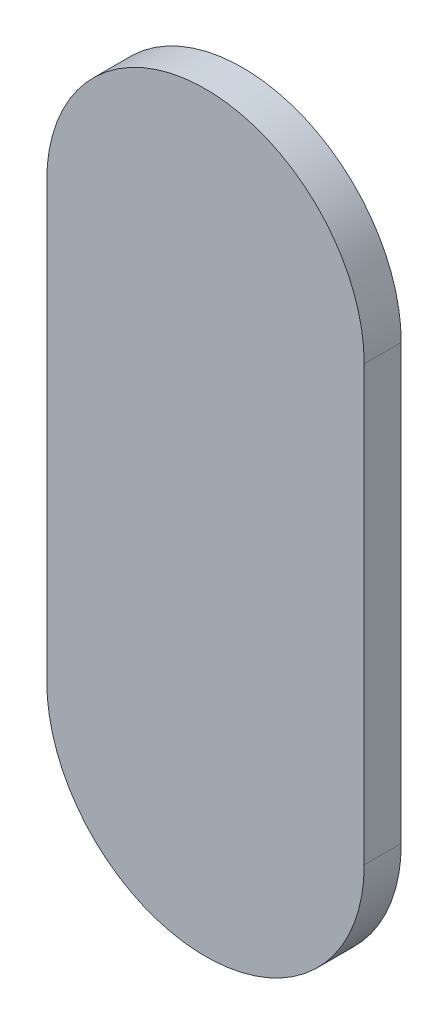
ISO-10303-21;
HEADER;
FILE_DESCRIPTION(('STEP AP214'),'2;1');
FILE_NAME('part.step','',(''),(''),'','','');
FILE_SCHEMA(('AUTOMOTIVE_DESIGN { 1 0 10303 214 1 1 1 1 }'));
ENDSEC;
DATA;
#1=APPLICATION_CONTEXT('core data for automotive mechanical design processes');
#2=APPLICATION_PROTOCOL_DEFINITION('international standard','automotive_design',2000,#1);
#3=PRODUCT_CONTEXT('',#1,'mechanical');
#4=PRODUCT('Part','Part','',(#3));
#5=PRODUCT_RELATED_PRODUCT_CATEGORY('part','',(#4));
#6=PRODUCT_DEFINITION_FORMATION('','',#4);
#7=PRODUCT_DEFINITION_CONTEXT('part definition',#1,'design');
#8=PRODUCT_DEFINITION('design','',#6,#7);
#9=PRODUCT_DEFINITION_SHAPE('','',#8);
#10=(LENGTH_UNIT() NAMED_UNIT(*) SI_UNIT(.MILLI.,.METRE.));
#11=(NAMED_UNIT(*) PLANE_ANGLE_UNIT() SI_UNIT($,.RADIAN.));
#12=(NAMED_UNIT(*) SI_UNIT($,.STERADIAN.) SOLID_ANGLE_UNIT());
#13=UNCERTAINTY_MEASURE_WITH_UNIT(LENGTH_MEASURE(1.E-05),#10,'distance_accuracy_value','');
#14=(GEOMETRIC_REPRESENTATION_CONTEXT(3) GLOBAL_UNCERTAINTY_ASSIGNED_CONTEXT((#13)) GLOBAL_UNIT_ASSIGNED_CONTEXT((#10,
#11,#12)) REPRESENTATION_CONTEXT('',''));
#15=CARTESIAN_POINT('',(0.,0.,0.));
#16=DIRECTION('',(0.,0.,1.));
#17=DIRECTION('',(1.,0.,0.));
#18=AXIS2_PLACEMENT_3D('',#15,#16,#17);
#19=CARTESIAN_POINT('',(148.79,-112.84,1.635));
#20=DIRECTION('',(0.,0.,1.));
#21=DIRECTION('',(1.,0.,0.));
#22=AXIS2_PLACEMENT_3D('',#19,#20,#21);
#23=PLANE('',#22);
#24=DIRECTION('',(0.,1.,0.));
#25=VECTOR('',#24,1.);
#26=CARTESIAN_POINT('',(148.79,-112.84,1.635));
#27=LINE('',#26,#25);
#28=CARTESIAN_POINT('',(148.79,-112.84,1.635));
#29=VERTEX_POINT('',#28);
#30=CARTESIAN_POINT('',(148.79,-112.43,1.635));
#31=VERTEX_POINT('',#30);
#32=EDGE_CURVE('E99',#29,#31,#27,.T.);
#33=ORIENTED_EDGE('',*,*,#32,.T.);
#34=CARTESIAN_POINT('',(148.64,-112.43,1.635));
#35=DIRECTION('',(0.,0.,1.));
#36=DIRECTION('',(1.,-1.894780628694E-13,0.));
#37=AXIS2_PLACEMENT_3D('',#34,#35,#36);
#38=CIRCLE('',#37,0.15);
#39=CARTESIAN_POINT('',(148.49,-112.43,1.635));
#40=VERTEX_POINT('',#39);
#41=EDGE_CURVE('E78',#31,#40,#38,.T.);
#42=ORIENTED_EDGE('',*,*,#41,.T.);
#43=DIRECTION('',(0.,-1.,0.));
#44=VECTOR('',#43,1.);
#45=CARTESIAN_POINT('',(148.49,-112.43,1.635));
#46=LINE('',#45,#44);
#47=CARTESIAN_POINT('',(148.49,-112.84,1.635));
#48=VERTEX_POINT('',#47);
#49=EDGE_CURVE('E83',#40,#48,#46,.T.);
#50=ORIENTED_EDGE('',*,*,#49,.T.);
#51=CARTESIAN_POINT('',(148.64,-112.84,1.635));
#52=DIRECTION('',(0.,0.,1.));
#53=DIRECTION('',(-1.,0.,0.));
#54=AXIS2_PLACEMENT_3D('',#51,#52,#53);
#55=CIRCLE('',#54,0.15);
#56=EDGE_CURVE('E11',#48,#29,#55,.T.);
#57=ORIENTED_EDGE('',*,*,#56,.T.);
#58=EDGE_LOOP('',(#33,#42,#50,#57));
#59=FACE_BOUND('',#58,.T.);
#60=ADVANCED_FACE('F17',(#59),#23,.T.);
#61=CARTESIAN_POINT('',(148.79,-112.84,1.6));
#62=DIRECTION('',(0.,0.,1.));
#63=DIRECTION('',(1.,0.,0.));
#64=AXIS2_PLACEMENT_3D('',#61,#62,#63);
#65=PLANE('',#64);
#66=CARTESIAN_POINT('',(148.64,-112.84,1.6));
#67=DIRECTION('',(0.,0.,1.));
#68=DIRECTION('',(-1.,0.,0.));
#69=AXIS2_PLACEMENT_3D('',#66,#67,#68);
#70=CIRCLE('',#69,0.15);
#71=CARTESIAN_POINT('',(148.49,-112.84,1.6));
#72=VERTEX_POINT('',#71);
#73=CARTESIAN_POINT('',(148.79,-112.84,1.6));
#74=VERTEX_POINT('',#73);
#75=EDGE_CURVE('E20',#72,#74,#70,.T.);
#76=ORIENTED_EDGE('',*,*,#75,.F.);
#77=DIRECTION('',(0.,-1.,0.));
#78=VECTOR('',#77,1.);
#79=CARTESIAN_POINT('',(148.49,-112.43,1.6));
#80=LINE('',#79,#78);
#81=CARTESIAN_POINT('',(148.49,-112.43,1.6));
#82=VERTEX_POINT('',#81);
#83=EDGE_CURVE('E68',#82,#72,#80,.T.);
#84=ORIENTED_EDGE('',*,*,#83,.F.);
#85=CARTESIAN_POINT('',(148.64,-112.43,1.6));
#86=DIRECTION('',(0.,0.,1.));
#87=DIRECTION('',(1.,-1.894780628694E-13,0.));
#88=AXIS2_PLACEMENT_3D('',#85,#86,#87);
#89=CIRCLE('',#88,0.15);
#90=CARTESIAN_POINT('',(148.79,-112.43,1.6));
#91=VERTEX_POINT('',#90);
#92=EDGE_CURVE('E72',#91,#82,#89,.T.);
#93=ORIENTED_EDGE('',*,*,#92,.F.);
#94=DIRECTION('',(0.,1.,0.));
#95=VECTOR('',#94,1.);
#96=CARTESIAN_POINT('',(148.79,-112.84,1.6));
#97=LINE('',#96,#95);
#98=EDGE_CURVE('E117',#74,#91,#97,.T.);
#99=ORIENTED_EDGE('',*,*,#98,.F.);
#100=EDGE_LOOP('',(#76,#84,#93,#99));
#101=FACE_BOUND('',#100,.T.);
#102=ADVANCED_FACE('F70',(#101),#65,.F.);
#103=CARTESIAN_POINT('',(148.64,-112.84,1.6));
#104=DIRECTION('',(0.,0.,-1.));
#105=DIRECTION('',(-1.,0.,0.));
#106=AXIS2_PLACEMENT_3D('',#103,#104,#105);
#107=CYLINDRICAL_SURFACE('',#106,0.15);
#108=ORIENTED_EDGE('',*,*,#75,.T.);
#109=DIRECTION('',(0.,0.,1.));
#110=VECTOR('',#109,1.);
#111=CARTESIAN_POINT('',(148.79,-112.84,1.6));
#112=LINE('',#111,#110);
#113=EDGE_CURVE('E93',#74,#29,#112,.T.);
#114=ORIENTED_EDGE('',*,*,#113,.T.);
#115=ORIENTED_EDGE('',*,*,#56,.F.);
#116=DIRECTION('',(0.,0.,1.));
#117=VECTOR('',#116,1.);
#118=CARTESIAN_POINT('',(148.49,-112.84,1.6));
#119=LINE('',#118,#117);
#120=EDGE_CURVE('E77',#72,#48,#119,.T.);
#121=ORIENTED_EDGE('',*,*,#120,.F.);
#122=EDGE_LOOP('',(#108,#114,#115,#121));
#123=FACE_BOUND('',#122,.T.);
#124=ADVANCED_FACE('F113',(#123),#107,.T.);
#125=CARTESIAN_POINT('',(148.49,-112.43,1.6));
#126=DIRECTION('',(1.,0.,0.));
#127=DIRECTION('',(0.,1.,0.));
#128=AXIS2_PLACEMENT_3D('',#125,#126,#127);
#129=PLANE('',#128);
#130=ORIENTED_EDGE('',*,*,#83,.T.);
#131=ORIENTED_EDGE('',*,*,#120,.T.);
#132=ORIENTED_EDGE('',*,*,#49,.F.);
#133=DIRECTION('',(0.,0.,1.));
#134=VECTOR('',#133,1.);
#135=CARTESIAN_POINT('',(148.49,-112.43,1.6));
#136=LINE('',#135,#134);
#137=EDGE_CURVE('E81',#82,#40,#136,.T.);
#138=ORIENTED_EDGE('',*,*,#137,.F.);
#139=EDGE_LOOP('',(#130,#131,#132,#138));
#140=FACE_BOUND('',#139,.T.);
#141=ADVANCED_FACE('F82',(#140),#129,.F.);
#142=CARTESIAN_POINT('',(148.64,-112.43,1.6));
#143=DIRECTION('',(0.,0.,-1.));
#144=DIRECTION('',(1.,-1.894780628694E-13,0.));
#145=AXIS2_PLACEMENT_3D('',#142,#143,#144);
#146=CYLINDRICAL_SURFACE('',#145,0.15);
#147=ORIENTED_EDGE('',*,*,#92,.T.);
#148=ORIENTED_EDGE('',*,*,#137,.T.);
#149=ORIENTED_EDGE('',*,*,#41,.F.);
#150=DIRECTION('',(0.,0.,1.));
#151=VECTOR('',#150,1.);
#152=CARTESIAN_POINT('',(148.79,-112.43,1.6));
#153=LINE('',#152,#151);
#154=EDGE_CURVE('E90',#91,#31,#153,.T.);
#155=ORIENTED_EDGE('',*,*,#154,.F.);
#156=EDGE_LOOP('',(#147,#148,#149,#155));
#157=FACE_BOUND('',#156,.T.);
#158=ADVANCED_FACE('F88',(#157),#146,.T.);
#159=CARTESIAN_POINT('',(148.79,-112.84,1.6));
#160=DIRECTION('',(-1.,0.,0.));
#161=DIRECTION('',(0.,0.,1.));
#162=AXIS2_PLACEMENT_3D('',#159,#160,#161);
#163=PLANE('',#162);
#164=ORIENTED_EDGE('',*,*,#98,.T.);
#165=ORIENTED_EDGE('',*,*,#154,.T.);
#166=ORIENTED_EDGE('',*,*,#32,.F.);
#167=ORIENTED_EDGE('',*,*,#113,.F.);
#168=EDGE_LOOP('',(#164,#165,#166,#167));
#169=FACE_BOUND('',#168,.T.);
#170=ADVANCED_FACE('F116',(#169),#163,.F.);
#171=CLOSED_SHELL('',(#60,#102,#124,#141,#158,#170));
#172=MANIFOLD_SOLID_BREP('B1',#171);
#173=ADVANCED_BREP_SHAPE_REPRESENTATION('',(#18,#172),#14);
#174=SHAPE_DEFINITION_REPRESENTATION(#9,#173);
ENDSEC;
END-ISO-10303-21;
